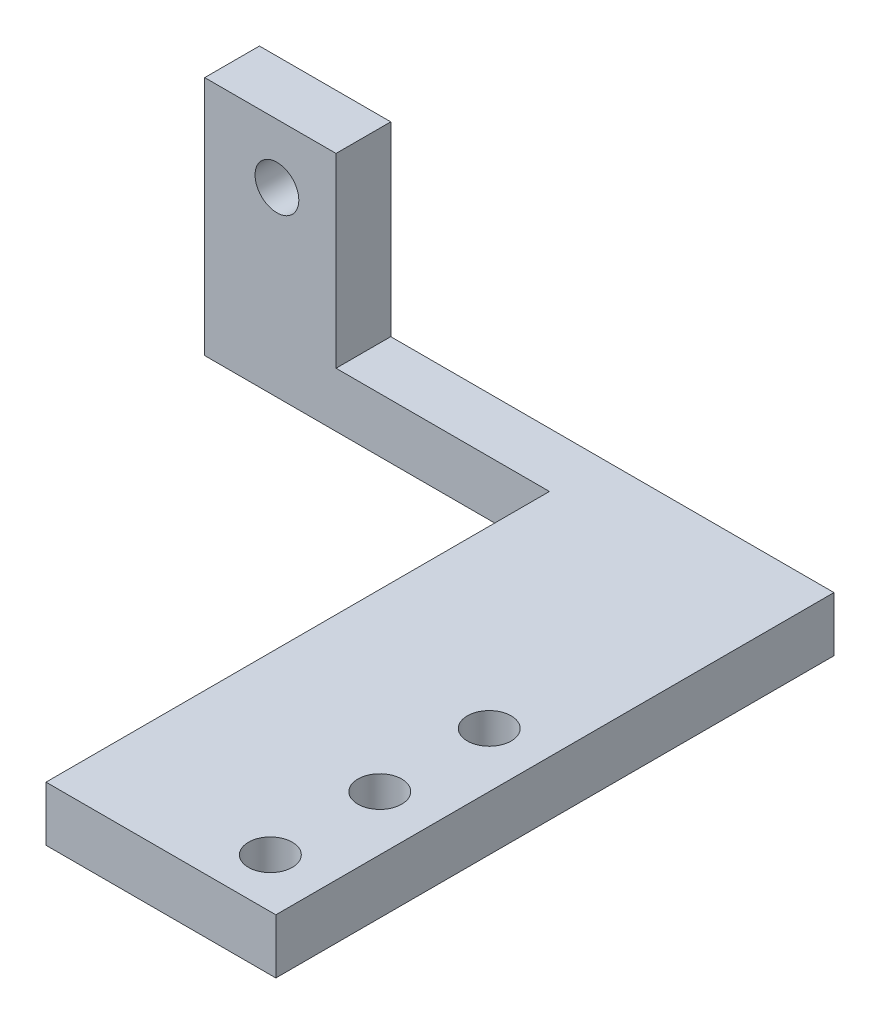
ISO-10303-21;
HEADER;
FILE_DESCRIPTION(('STEP AP214'),'2;1');
FILE_NAME('part.step','',(''),(''),'','','');
FILE_SCHEMA(('AUTOMOTIVE_DESIGN { 1 0 10303 214 1 1 1 1 }'));
ENDSEC;
DATA;
#1=APPLICATION_CONTEXT('core data for automotive mechanical design processes');
#2=APPLICATION_PROTOCOL_DEFINITION('international standard','automotive_design',2000,#1);
#3=PRODUCT_CONTEXT('',#1,'mechanical');
#4=PRODUCT('Part','Part','',(#3));
#5=PRODUCT_RELATED_PRODUCT_CATEGORY('part','',(#4));
#6=PRODUCT_DEFINITION_FORMATION('','',#4);
#7=PRODUCT_DEFINITION_CONTEXT('part definition',#1,'design');
#8=PRODUCT_DEFINITION('design','',#6,#7);
#9=PRODUCT_DEFINITION_SHAPE('','',#8);
#10=(LENGTH_UNIT() NAMED_UNIT(*) SI_UNIT(.MILLI.,.METRE.));
#11=(NAMED_UNIT(*) PLANE_ANGLE_UNIT() SI_UNIT($,.RADIAN.));
#12=(NAMED_UNIT(*) SI_UNIT($,.STERADIAN.) SOLID_ANGLE_UNIT());
#13=UNCERTAINTY_MEASURE_WITH_UNIT(LENGTH_MEASURE(1.E-05),#10,'distance_accuracy_value','');
#14=(GEOMETRIC_REPRESENTATION_CONTEXT(3) GLOBAL_UNCERTAINTY_ASSIGNED_CONTEXT((#13)) GLOBAL_UNIT_ASSIGNED_CONTEXT((#10,
#11,#12)) REPRESENTATION_CONTEXT('',''));
#15=CARTESIAN_POINT('',(0.,0.,0.));
#16=DIRECTION('',(0.,0.,1.));
#17=DIRECTION('',(1.,0.,0.));
#18=AXIS2_PLACEMENT_3D('',#15,#16,#17);
#19=CARTESIAN_POINT('',(0.,5.,0.));
#20=DIRECTION('',(0.,-1.,0.));
#21=DIRECTION('',(0.,0.,-1.));
#22=AXIS2_PLACEMENT_3D('',#19,#20,#21);
#23=PLANE('',#22);
#24=CARTESIAN_POINT('',(5.69672131147539,5.,21.3508196721311));
#25=DIRECTION('',(0.,-1.,0.));
#26=DIRECTION('',(0.,0.,-1.));
#27=AXIS2_PLACEMENT_3D('',#24,#25,#26);
#28=CIRCLE('',#27,2.);
#29=CARTESIAN_POINT('',(5.69672131147539,5.,19.3508196721311));
#30=VERTEX_POINT('',#29);
#31=EDGE_CURVE('E141',#30,#30,#28,.T.);
#32=ORIENTED_EDGE('',*,*,#31,.T.);
#33=EDGE_LOOP('',(#32));
#34=FACE_BOUND('',#33,.T.);
#35=CARTESIAN_POINT('',(5.69672131147539,5.,11.3508196721311));
#36=DIRECTION('',(0.,-1.,0.));
#37=DIRECTION('',(0.,0.,-1.));
#38=AXIS2_PLACEMENT_3D('',#35,#36,#37);
#39=CIRCLE('',#38,2.);
#40=CARTESIAN_POINT('',(5.69672131147539,5.,9.35081967213113));
#41=VERTEX_POINT('',#40);
#42=EDGE_CURVE('E267',#41,#41,#39,.T.);
#43=ORIENTED_EDGE('',*,*,#42,.T.);
#44=EDGE_LOOP('',(#43));
#45=FACE_BOUND('',#44,.T.);
#46=CARTESIAN_POINT('',(5.69672131147539,5.,1.35081967213113));
#47=DIRECTION('',(0.,-1.,0.));
#48=DIRECTION('',(0.,0.,-1.));
#49=AXIS2_PLACEMENT_3D('',#46,#47,#48);
#50=CIRCLE('',#49,2.);
#51=CARTESIAN_POINT('',(5.69672131147539,5.,-0.649180327868869));
#52=VERTEX_POINT('',#51);
#53=EDGE_CURVE('E261',#52,#52,#50,.T.);
#54=ORIENTED_EDGE('',*,*,#53,.T.);
#55=EDGE_LOOP('',(#54));
#56=FACE_BOUND('',#55,.T.);
#57=DIRECTION('',(0.,0.,-1.));
#58=VECTOR('',#57,1.);
#59=CARTESIAN_POINT('',(-29.8032786885246,5.,-25.1491803278689));
#60=LINE('',#59,#58);
#61=CARTESIAN_POINT('',(-29.8032786885246,5.,-20.1491803278689));
#62=VERTEX_POINT('',#61);
#63=CARTESIAN_POINT('',(-29.8032786885246,5.,-25.1491803278689));
#64=VERTEX_POINT('',#63);
#65=EDGE_CURVE('E55',#62,#64,#60,.T.);
#66=ORIENTED_EDGE('',*,*,#65,.F.);
#67=DIRECTION('',(1.,0.,0.));
#68=VECTOR('',#67,1.);
#69=CARTESIAN_POINT('',(-10.3032786885246,5.,-20.1491803278689));
#70=LINE('',#69,#68);
#71=CARTESIAN_POINT('',(-10.3032786885246,5.,-20.1491803278689));
#72=VERTEX_POINT('',#71);
#73=EDGE_CURVE('E60',#62,#72,#70,.T.);
#74=ORIENTED_EDGE('',*,*,#73,.T.);
#75=DIRECTION('',(0.,0.,1.));
#76=VECTOR('',#75,1.);
#77=CARTESIAN_POINT('',(-10.3032786885246,5.,-20.1491803278689));
#78=LINE('',#77,#76);
#79=CARTESIAN_POINT('',(-10.3032786885246,5.,25.8508196721311));
#80=VERTEX_POINT('',#79);
#81=EDGE_CURVE('E158',#72,#80,#78,.T.);
#82=ORIENTED_EDGE('',*,*,#81,.T.);
#83=DIRECTION('',(1.,0.,0.));
#84=VECTOR('',#83,1.);
#85=CARTESIAN_POINT('',(10.6967213114754,5.,25.8508196721311));
#86=LINE('',#85,#84);
#87=CARTESIAN_POINT('',(10.6967213114754,5.,25.8508196721311));
#88=VERTEX_POINT('',#87);
#89=EDGE_CURVE('E95',#80,#88,#86,.T.);
#90=ORIENTED_EDGE('',*,*,#89,.T.);
#91=DIRECTION('',(0.,0.,-1.));
#92=VECTOR('',#91,1.);
#93=CARTESIAN_POINT('',(10.6967213114754,5.,-25.1491803278689));
#94=LINE('',#93,#92);
#95=CARTESIAN_POINT('',(10.6967213114754,5.,-25.1491803278689));
#96=VERTEX_POINT('',#95);
#97=EDGE_CURVE('E163',#88,#96,#94,.T.);
#98=ORIENTED_EDGE('',*,*,#97,.T.);
#99=DIRECTION('',(-1.,0.,0.));
#100=VECTOR('',#99,1.);
#101=CARTESIAN_POINT('',(10.6967213114754,5.,-25.1491803278689));
#102=LINE('',#101,#100);
#103=EDGE_CURVE('E166',#96,#64,#102,.T.);
#104=ORIENTED_EDGE('',*,*,#103,.T.);
#105=EDGE_LOOP('',(#66,#74,#82,#90,#98,#104));
#106=FACE_BOUND('',#105,.T.);
#107=ADVANCED_FACE('F39',(#34,#45,#56,#106),#23,.F.);
#108=CARTESIAN_POINT('',(-10.3032786885246,5.,-20.1491803278689));
#109=DIRECTION('',(1.,0.,0.));
#110=DIRECTION('',(0.,0.,-1.));
#111=AXIS2_PLACEMENT_3D('',#108,#109,#110);
#112=PLANE('',#111);
#113=DIRECTION('',(0.,0.,1.));
#114=VECTOR('',#113,1.);
#115=CARTESIAN_POINT('',(-10.3032786885246,0.,-20.1491803278689));
#116=LINE('',#115,#114);
#117=CARTESIAN_POINT('',(-10.3032786885246,0.,-20.1491803278689));
#118=VERTEX_POINT('',#117);
#119=CARTESIAN_POINT('',(-10.3032786885246,0.,25.8508196721311));
#120=VERTEX_POINT('',#119);
#121=EDGE_CURVE('E157',#118,#120,#116,.T.);
#122=ORIENTED_EDGE('',*,*,#121,.T.);
#123=DIRECTION('',(0.,-1.,0.));
#124=VECTOR('',#123,1.);
#125=CARTESIAN_POINT('',(-10.3032786885246,5.,25.8508196721311));
#126=LINE('',#125,#124);
#127=EDGE_CURVE('E11',#80,#120,#126,.T.);
#128=ORIENTED_EDGE('',*,*,#127,.F.);
#129=ORIENTED_EDGE('',*,*,#81,.F.);
#130=DIRECTION('',(0.,-1.,0.));
#131=VECTOR('',#130,1.);
#132=CARTESIAN_POINT('',(-10.3032786885246,5.,-20.1491803278689));
#133=LINE('',#132,#131);
#134=EDGE_CURVE('E171',#72,#118,#133,.T.);
#135=ORIENTED_EDGE('',*,*,#134,.T.);
#136=EDGE_LOOP('',(#122,#128,#129,#135));
#137=FACE_BOUND('',#136,.T.);
#138=ADVANCED_FACE('F41',(#137),#112,.F.);
#139=CARTESIAN_POINT('',(10.6967213114754,5.,25.8508196721311));
#140=DIRECTION('',(0.,0.,-1.));
#141=DIRECTION('',(-1.,0.,0.));
#142=AXIS2_PLACEMENT_3D('',#139,#140,#141);
#143=PLANE('',#142);
#144=DIRECTION('',(1.,0.,0.));
#145=VECTOR('',#144,1.);
#146=CARTESIAN_POINT('',(10.6967213114754,0.,25.8508196721311));
#147=LINE('',#146,#145);
#148=CARTESIAN_POINT('',(10.6967213114754,0.,25.8508196721311));
#149=VERTEX_POINT('',#148);
#150=EDGE_CURVE('E175',#120,#149,#147,.T.);
#151=ORIENTED_EDGE('',*,*,#150,.T.);
#152=DIRECTION('',(0.,-1.,0.));
#153=VECTOR('',#152,1.);
#154=CARTESIAN_POINT('',(10.6967213114754,5.,25.8508196721311));
#155=LINE('',#154,#153);
#156=EDGE_CURVE('E48',#88,#149,#155,.T.);
#157=ORIENTED_EDGE('',*,*,#156,.F.);
#158=ORIENTED_EDGE('',*,*,#89,.F.);
#159=ORIENTED_EDGE('',*,*,#127,.T.);
#160=EDGE_LOOP('',(#151,#157,#158,#159));
#161=FACE_BOUND('',#160,.T.);
#162=ADVANCED_FACE('F212',(#161),#143,.F.);
#163=CARTESIAN_POINT('',(10.6967213114754,5.,-25.1491803278689));
#164=DIRECTION('',(-1.,0.,0.));
#165=DIRECTION('',(0.,0.,1.));
#166=AXIS2_PLACEMENT_3D('',#163,#164,#165);
#167=PLANE('',#166);
#168=DIRECTION('',(0.,0.,-1.));
#169=VECTOR('',#168,1.);
#170=CARTESIAN_POINT('',(10.6967213114754,0.,-25.1491803278689));
#171=LINE('',#170,#169);
#172=CARTESIAN_POINT('',(10.6967213114754,0.,-25.1491803278689));
#173=VERTEX_POINT('',#172);
#174=EDGE_CURVE('E178',#149,#173,#171,.T.);
#175=ORIENTED_EDGE('',*,*,#174,.T.);
#176=DIRECTION('',(0.,-1.,0.));
#177=VECTOR('',#176,1.);
#178=CARTESIAN_POINT('',(10.6967213114754,5.,-25.1491803278689));
#179=LINE('',#178,#177);
#180=EDGE_CURVE('E123',#96,#173,#179,.T.);
#181=ORIENTED_EDGE('',*,*,#180,.F.);
#182=ORIENTED_EDGE('',*,*,#97,.F.);
#183=ORIENTED_EDGE('',*,*,#156,.T.);
#184=EDGE_LOOP('',(#175,#181,#182,#183));
#185=FACE_BOUND('',#184,.T.);
#186=ADVANCED_FACE('F199',(#185),#167,.F.);
#187=CARTESIAN_POINT('',(-5.35081967213117,5.,-25.1491803278689));
#188=DIRECTION('',(0.,0.,1.));
#189=DIRECTION('',(1.,0.,0.));
#190=AXIS2_PLACEMENT_3D('',#187,#188,#189);
#191=PLANE('',#190);
#192=CARTESIAN_POINT('',(-35.2032786885246,16.6,-25.1491803278689));
#193=DIRECTION('',(0.,0.,1.));
#194=DIRECTION('',(1.,0.,0.));
#195=AXIS2_PLACEMENT_3D('',#192,#193,#194);
#196=CIRCLE('',#195,2.);
#197=CARTESIAN_POINT('',(-33.2032786885246,16.6,-25.1491803278689));
#198=VERTEX_POINT('',#197);
#199=EDGE_CURVE('E243',#198,#198,#196,.T.);
#200=ORIENTED_EDGE('',*,*,#199,.T.);
#201=EDGE_LOOP('',(#200));
#202=FACE_BOUND('',#201,.T.);
#203=DIRECTION('',(-1.,0.,0.));
#204=VECTOR('',#203,1.);
#205=CARTESIAN_POINT('',(-5.35081967213117,0.,-25.1491803278689));
#206=LINE('',#205,#204);
#207=CARTESIAN_POINT('',(-41.8032786885246,0.,-25.1491803278689));
#208=VERTEX_POINT('',#207);
#209=EDGE_CURVE('E119',#173,#208,#206,.T.);
#210=ORIENTED_EDGE('',*,*,#209,.T.);
#211=DIRECTION('',(0.,-1.,0.));
#212=VECTOR('',#211,1.);
#213=CARTESIAN_POINT('',(-41.8032786885246,5.,-25.1491803278689));
#214=LINE('',#213,#212);
#215=CARTESIAN_POINT('',(-41.8032786885246,22.,-25.1491803278689));
#216=VERTEX_POINT('',#215);
#217=EDGE_CURVE('E112',#216,#208,#214,.T.);
#218=ORIENTED_EDGE('',*,*,#217,.F.);
#219=DIRECTION('',(-1.,0.,0.));
#220=VECTOR('',#219,1.);
#221=CARTESIAN_POINT('',(-41.8032786885246,22.,-25.1491803278689));
#222=LINE('',#221,#220);
#223=CARTESIAN_POINT('',(-29.8032786885246,22.,-25.1491803278689));
#224=VERTEX_POINT('',#223);
#225=EDGE_CURVE('E117',#224,#216,#222,.T.);
#226=ORIENTED_EDGE('',*,*,#225,.F.);
#227=DIRECTION('',(0.,-1.,0.));
#228=VECTOR('',#227,1.);
#229=CARTESIAN_POINT('',(-29.8032786885246,22.,-25.1491803278689));
#230=LINE('',#229,#228);
#231=EDGE_CURVE('E149',#224,#64,#230,.T.);
#232=ORIENTED_EDGE('',*,*,#231,.T.);
#233=ORIENTED_EDGE('',*,*,#103,.F.);
#234=ORIENTED_EDGE('',*,*,#180,.T.);
#235=EDGE_LOOP('',(#210,#218,#226,#232,#233,#234));
#236=FACE_BOUND('',#235,.T.);
#237=ADVANCED_FACE('F114',(#202,#236),#191,.F.);
#238=CARTESIAN_POINT('',(-41.8032786885246,5.,-25.1491803278689));
#239=DIRECTION('',(1.,0.,0.));
#240=DIRECTION('',(0.,0.,-1.));
#241=AXIS2_PLACEMENT_3D('',#238,#239,#240);
#242=PLANE('',#241);
#243=DIRECTION('',(0.,0.,1.));
#244=VECTOR('',#243,1.);
#245=CARTESIAN_POINT('',(-41.8032786885246,0.,-25.1491803278689));
#246=LINE('',#245,#244);
#247=CARTESIAN_POINT('',(-41.8032786885246,0.,-20.1491803278689));
#248=VERTEX_POINT('',#247);
#249=EDGE_CURVE('E184',#208,#248,#246,.T.);
#250=ORIENTED_EDGE('',*,*,#249,.T.);
#251=DIRECTION('',(0.,-1.,0.));
#252=VECTOR('',#251,1.);
#253=CARTESIAN_POINT('',(-41.8032786885246,5.,-20.1491803278689));
#254=LINE('',#253,#252);
#255=CARTESIAN_POINT('',(-41.8032786885246,22.,-20.1491803278689));
#256=VERTEX_POINT('',#255);
#257=EDGE_CURVE('E124',#256,#248,#254,.T.);
#258=ORIENTED_EDGE('',*,*,#257,.F.);
#259=DIRECTION('',(0.,0.,1.));
#260=VECTOR('',#259,1.);
#261=CARTESIAN_POINT('',(-41.8032786885246,22.,-25.1491803278689));
#262=LINE('',#261,#260);
#263=EDGE_CURVE('E127',#216,#256,#262,.T.);
#264=ORIENTED_EDGE('',*,*,#263,.F.);
#265=ORIENTED_EDGE('',*,*,#217,.T.);
#266=EDGE_LOOP('',(#250,#258,#264,#265));
#267=FACE_BOUND('',#266,.T.);
#268=ADVANCED_FACE('F128',(#267),#242,.F.);
#269=CARTESIAN_POINT('',(-10.3032786885246,5.,-20.1491803278689));
#270=DIRECTION('',(0.,0.,-1.));
#271=DIRECTION('',(-1.,0.,0.));
#272=AXIS2_PLACEMENT_3D('',#269,#270,#271);
#273=PLANE('',#272);
#274=CARTESIAN_POINT('',(-35.2032786885246,16.6,-20.1491803278689));
#275=DIRECTION('',(0.,0.,1.));
#276=DIRECTION('',(1.,0.,0.));
#277=AXIS2_PLACEMENT_3D('',#274,#275,#276);
#278=CIRCLE('',#277,2.);
#279=CARTESIAN_POINT('',(-33.2032786885246,16.6,-20.1491803278689));
#280=VERTEX_POINT('',#279);
#281=EDGE_CURVE('E247',#280,#280,#278,.T.);
#282=ORIENTED_EDGE('',*,*,#281,.F.);
#283=EDGE_LOOP('',(#282));
#284=FACE_BOUND('',#283,.T.);
#285=DIRECTION('',(1.,0.,0.));
#286=VECTOR('',#285,1.);
#287=CARTESIAN_POINT('',(-10.3032786885246,0.,-20.1491803278689));
#288=LINE('',#287,#286);
#289=EDGE_CURVE('E88',#248,#118,#288,.T.);
#290=ORIENTED_EDGE('',*,*,#289,.T.);
#291=ORIENTED_EDGE('',*,*,#134,.F.);
#292=ORIENTED_EDGE('',*,*,#73,.F.);
#293=DIRECTION('',(0.,-1.,0.));
#294=VECTOR('',#293,1.);
#295=CARTESIAN_POINT('',(-29.8032786885246,22.,-20.1491803278689));
#296=LINE('',#295,#294);
#297=CARTESIAN_POINT('',(-29.8032786885246,22.,-20.1491803278689));
#298=VERTEX_POINT('',#297);
#299=EDGE_CURVE('E153',#298,#62,#296,.T.);
#300=ORIENTED_EDGE('',*,*,#299,.F.);
#301=DIRECTION('',(1.,0.,0.));
#302=VECTOR('',#301,1.);
#303=CARTESIAN_POINT('',(-41.8032786885246,22.,-20.1491803278689));
#304=LINE('',#303,#302);
#305=EDGE_CURVE('E132',#256,#298,#304,.T.);
#306=ORIENTED_EDGE('',*,*,#305,.F.);
#307=ORIENTED_EDGE('',*,*,#257,.T.);
#308=EDGE_LOOP('',(#290,#291,#292,#300,#306,#307));
#309=FACE_BOUND('',#308,.T.);
#310=ADVANCED_FACE('F204',(#284,#309),#273,.F.);
#311=CARTESIAN_POINT('',(0.,0.,0.));
#312=DIRECTION('',(0.,-1.,0.));
#313=DIRECTION('',(0.,0.,-1.));
#314=AXIS2_PLACEMENT_3D('',#311,#312,#313);
#315=PLANE('',#314);
#316=CARTESIAN_POINT('',(5.69672131147539,0.,21.3508196721311));
#317=DIRECTION('',(0.,-1.,0.));
#318=DIRECTION('',(0.,0.,-1.));
#319=AXIS2_PLACEMENT_3D('',#316,#317,#318);
#320=CIRCLE('',#319,2.);
#321=CARTESIAN_POINT('',(5.69672131147539,0.,19.3508196721311));
#322=VERTEX_POINT('',#321);
#323=EDGE_CURVE('E257',#322,#322,#320,.T.);
#324=ORIENTED_EDGE('',*,*,#323,.F.);
#325=EDGE_LOOP('',(#324));
#326=FACE_BOUND('',#325,.T.);
#327=CARTESIAN_POINT('',(5.69672131147539,0.,11.3508196721311));
#328=DIRECTION('',(0.,-1.,0.));
#329=DIRECTION('',(0.,0.,-1.));
#330=AXIS2_PLACEMENT_3D('',#327,#328,#329);
#331=CIRCLE('',#330,2.);
#332=CARTESIAN_POINT('',(5.69672131147539,0.,9.35081967213113));
#333=VERTEX_POINT('',#332);
#334=EDGE_CURVE('E252',#333,#333,#331,.T.);
#335=ORIENTED_EDGE('',*,*,#334,.F.);
#336=EDGE_LOOP('',(#335));
#337=FACE_BOUND('',#336,.T.);
#338=CARTESIAN_POINT('',(5.69672131147539,0.,1.35081967213113));
#339=DIRECTION('',(0.,-1.,0.));
#340=DIRECTION('',(0.,0.,-1.));
#341=AXIS2_PLACEMENT_3D('',#338,#339,#340);
#342=CIRCLE('',#341,2.);
#343=CARTESIAN_POINT('',(5.69672131147539,0.,-0.649180327868869));
#344=VERTEX_POINT('',#343);
#345=EDGE_CURVE('E246',#344,#344,#342,.T.);
#346=ORIENTED_EDGE('',*,*,#345,.F.);
#347=EDGE_LOOP('',(#346));
#348=FACE_BOUND('',#347,.T.);
#349=ORIENTED_EDGE('',*,*,#121,.F.);
#350=ORIENTED_EDGE('',*,*,#289,.F.);
#351=ORIENTED_EDGE('',*,*,#249,.F.);
#352=ORIENTED_EDGE('',*,*,#209,.F.);
#353=ORIENTED_EDGE('',*,*,#174,.F.);
#354=ORIENTED_EDGE('',*,*,#150,.F.);
#355=EDGE_LOOP('',(#349,#350,#351,#352,#353,#354));
#356=FACE_BOUND('',#355,.T.);
#357=ADVANCED_FACE('F203',(#326,#337,#348,#356),#315,.T.);
#358=CARTESIAN_POINT('',(-29.8032786885246,22.,-25.1491803278689));
#359=DIRECTION('',(-1.,0.,0.));
#360=DIRECTION('',(0.,0.,1.));
#361=AXIS2_PLACEMENT_3D('',#358,#359,#360);
#362=PLANE('',#361);
#363=ORIENTED_EDGE('',*,*,#65,.T.);
#364=ORIENTED_EDGE('',*,*,#231,.F.);
#365=DIRECTION('',(0.,0.,-1.));
#366=VECTOR('',#365,1.);
#367=CARTESIAN_POINT('',(-29.8032786885246,22.,-25.1491803278689));
#368=LINE('',#367,#366);
#369=EDGE_CURVE('E136',#298,#224,#368,.T.);
#370=ORIENTED_EDGE('',*,*,#369,.F.);
#371=ORIENTED_EDGE('',*,*,#299,.T.);
#372=EDGE_LOOP('',(#363,#364,#370,#371));
#373=FACE_BOUND('',#372,.T.);
#374=ADVANCED_FACE('F207',(#373),#362,.F.);
#375=CARTESIAN_POINT('',(0.,22.,0.));
#376=DIRECTION('',(0.,-1.,0.));
#377=DIRECTION('',(0.,0.,-1.));
#378=AXIS2_PLACEMENT_3D('',#375,#376,#377);
#379=PLANE('',#378);
#380=ORIENTED_EDGE('',*,*,#225,.T.);
#381=ORIENTED_EDGE('',*,*,#263,.T.);
#382=ORIENTED_EDGE('',*,*,#305,.T.);
#383=ORIENTED_EDGE('',*,*,#369,.T.);
#384=EDGE_LOOP('',(#380,#381,#382,#383));
#385=FACE_BOUND('',#384,.T.);
#386=ADVANCED_FACE('F134',(#385),#379,.F.);
#387=CARTESIAN_POINT('',(5.69672131147539,20.,1.35081967213113));
#388=DIRECTION('',(0.,-1.,0.));
#389=DIRECTION('',(0.,0.,-1.));
#390=AXIS2_PLACEMENT_3D('',#387,#388,#389);
#391=CYLINDRICAL_SURFACE('',#390,2.);
#392=ORIENTED_EDGE('',*,*,#345,.T.);
#393=EDGE_LOOP('',(#392));
#394=FACE_BOUND('',#393,.T.);
#395=ORIENTED_EDGE('',*,*,#53,.F.);
#396=EDGE_LOOP('',(#395));
#397=FACE_BOUND('',#396,.T.);
#398=ADVANCED_FACE('F286',(#394,#397),#391,.F.);
#399=CARTESIAN_POINT('',(5.69672131147539,20.,11.3508196721311));
#400=DIRECTION('',(0.,-1.,0.));
#401=DIRECTION('',(0.,0.,-1.));
#402=AXIS2_PLACEMENT_3D('',#399,#400,#401);
#403=CYLINDRICAL_SURFACE('',#402,2.);
#404=ORIENTED_EDGE('',*,*,#334,.T.);
#405=EDGE_LOOP('',(#404));
#406=FACE_BOUND('',#405,.T.);
#407=ORIENTED_EDGE('',*,*,#42,.F.);
#408=EDGE_LOOP('',(#407));
#409=FACE_BOUND('',#408,.T.);
#410=ADVANCED_FACE('F277',(#406,#409),#403,.F.);
#411=CARTESIAN_POINT('',(5.69672131147539,20.,21.3508196721311));
#412=DIRECTION('',(0.,-1.,0.));
#413=DIRECTION('',(0.,0.,-1.));
#414=AXIS2_PLACEMENT_3D('',#411,#412,#413);
#415=CYLINDRICAL_SURFACE('',#414,2.);
#416=ORIENTED_EDGE('',*,*,#323,.T.);
#417=EDGE_LOOP('',(#416));
#418=FACE_BOUND('',#417,.T.);
#419=ORIENTED_EDGE('',*,*,#31,.F.);
#420=EDGE_LOOP('',(#419));
#421=FACE_BOUND('',#420,.T.);
#422=ADVANCED_FACE('F274',(#418,#421),#415,.F.);
#423=CARTESIAN_POINT('',(-35.2032786885246,16.6,-40.1491803278689));
#424=DIRECTION('',(0.,0.,1.));
#425=DIRECTION('',(1.,0.,0.));
#426=AXIS2_PLACEMENT_3D('',#423,#424,#425);
#427=CYLINDRICAL_SURFACE('',#426,2.);
#428=ORIENTED_EDGE('',*,*,#281,.T.);
#429=EDGE_LOOP('',(#428));
#430=FACE_BOUND('',#429,.T.);
#431=ORIENTED_EDGE('',*,*,#199,.F.);
#432=EDGE_LOOP('',(#431));
#433=FACE_BOUND('',#432,.T.);
#434=ADVANCED_FACE('F276',(#430,#433),#427,.F.);
#435=CLOSED_SHELL('',(#107,#138,#162,#186,#237,#268,#310,#357,#374,#386,#398,#410,#422,#434));
#436=MANIFOLD_SOLID_BREP('B2',#435);
#437=ADVANCED_BREP_SHAPE_REPRESENTATION('',(#18,#436),#14);
#438=SHAPE_DEFINITION_REPRESENTATION(#9,#437);
ENDSEC;
END-ISO-10303-21;
